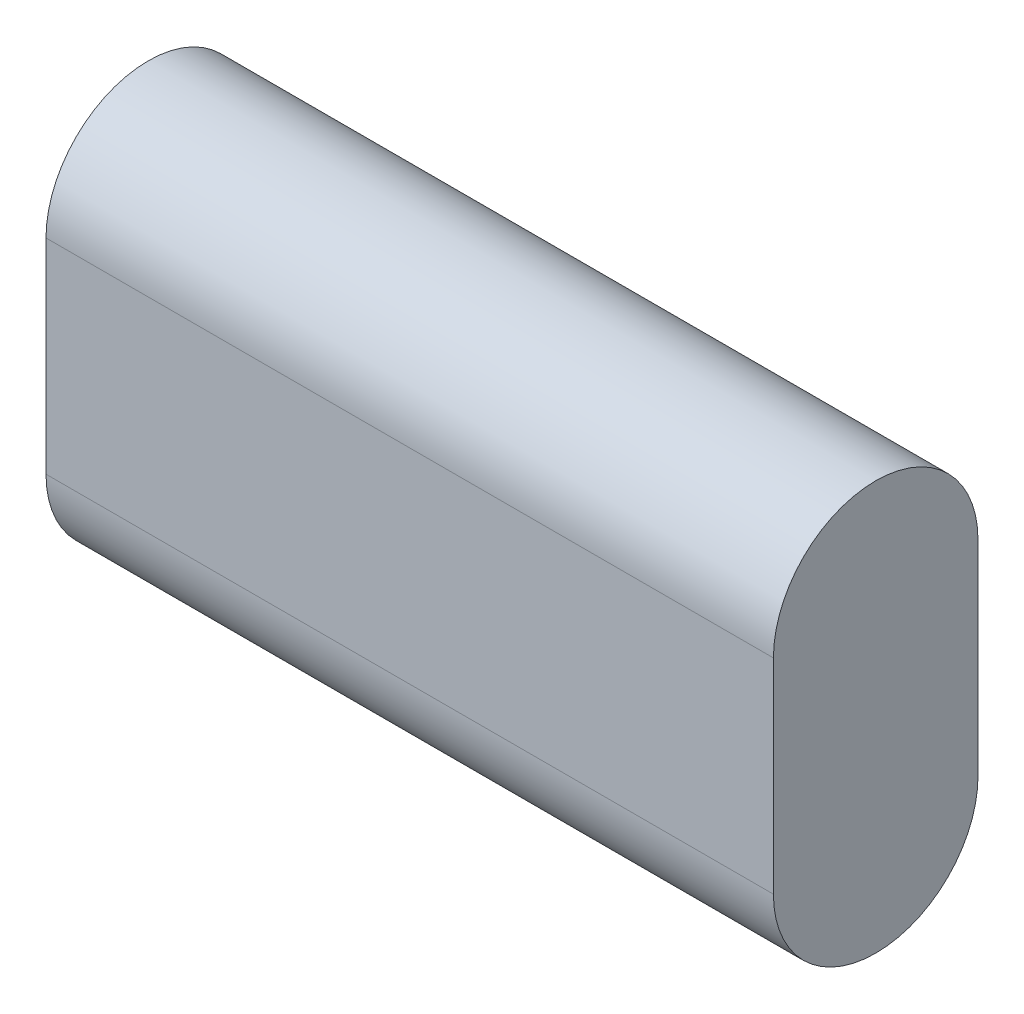
ISO-10303-21;
HEADER;
FILE_DESCRIPTION(('STEP AP214'),'2;1');
FILE_NAME('part.step','',(''),(''),'','','');
FILE_SCHEMA(('AUTOMOTIVE_DESIGN { 1 0 10303 214 1 1 1 1 }'));
ENDSEC;
DATA;
#1=APPLICATION_CONTEXT('core data for automotive mechanical design processes');
#2=APPLICATION_PROTOCOL_DEFINITION('international standard','automotive_design',2000,#1);
#3=PRODUCT_CONTEXT('',#1,'mechanical');
#4=PRODUCT('Part','Part','',(#3));
#5=PRODUCT_RELATED_PRODUCT_CATEGORY('part','',(#4));
#6=PRODUCT_DEFINITION_FORMATION('','',#4);
#7=PRODUCT_DEFINITION_CONTEXT('part definition',#1,'design');
#8=PRODUCT_DEFINITION('design','',#6,#7);
#9=PRODUCT_DEFINITION_SHAPE('','',#8);
#10=(LENGTH_UNIT() NAMED_UNIT(*) SI_UNIT(.MILLI.,.METRE.));
#11=(NAMED_UNIT(*) PLANE_ANGLE_UNIT() SI_UNIT($,.RADIAN.));
#12=(NAMED_UNIT(*) SI_UNIT($,.STERADIAN.) SOLID_ANGLE_UNIT());
#13=UNCERTAINTY_MEASURE_WITH_UNIT(LENGTH_MEASURE(1.E-05),#10,'distance_accuracy_value','');
#14=(GEOMETRIC_REPRESENTATION_CONTEXT(3) GLOBAL_UNCERTAINTY_ASSIGNED_CONTEXT((#13)) GLOBAL_UNIT_ASSIGNED_CONTEXT((#10,
#11,#12)) REPRESENTATION_CONTEXT('',''));
#15=CARTESIAN_POINT('',(0.,0.,0.));
#16=DIRECTION('',(0.,0.,1.));
#17=DIRECTION('',(1.,0.,0.));
#18=AXIS2_PLACEMENT_3D('',#15,#16,#17);
#19=CARTESIAN_POINT('',(64.,0.,0.));
#20=DIRECTION('',(-1.,0.,0.));
#21=DIRECTION('',(0.,0.,1.));
#22=AXIS2_PLACEMENT_3D('',#19,#20,#21);
#23=CYLINDRICAL_SURFACE('',#22,9.);
#24=CARTESIAN_POINT('',(0.,0.,0.));
#25=DIRECTION('',(1.,0.,0.));
#26=DIRECTION('',(0.,0.,-1.));
#27=AXIS2_PLACEMENT_3D('',#24,#25,#26);
#28=CIRCLE('',#27,9.);
#29=CARTESIAN_POINT('',(0.,0.,9.));
#30=VERTEX_POINT('',#29);
#31=CARTESIAN_POINT('',(0.,0.,-9.));
#32=VERTEX_POINT('',#31);
#33=EDGE_CURVE('E99',#30,#32,#28,.T.);
#34=ORIENTED_EDGE('',*,*,#33,.T.);
#35=DIRECTION('',(-1.,0.,0.));
#36=VECTOR('',#35,1.);
#37=CARTESIAN_POINT('',(64.,0.,-9.));
#38=LINE('',#37,#36);
#39=CARTESIAN_POINT('',(64.,0.,-9.));
#40=VERTEX_POINT('',#39);
#41=EDGE_CURVE('E11',#40,#32,#38,.T.);
#42=ORIENTED_EDGE('',*,*,#41,.F.);
#43=CARTESIAN_POINT('',(64.,0.,0.));
#44=DIRECTION('',(1.,0.,0.));
#45=DIRECTION('',(0.,0.,-1.));
#46=AXIS2_PLACEMENT_3D('',#43,#44,#45);
#47=CIRCLE('',#46,9.);
#48=CARTESIAN_POINT('',(64.,0.,9.));
#49=VERTEX_POINT('',#48);
#50=EDGE_CURVE('E87',#49,#40,#47,.T.);
#51=ORIENTED_EDGE('',*,*,#50,.F.);
#52=DIRECTION('',(-1.,0.,0.));
#53=VECTOR('',#52,1.);
#54=CARTESIAN_POINT('',(64.,0.,9.));
#55=LINE('',#54,#53);
#56=EDGE_CURVE('E95',#49,#30,#55,.T.);
#57=ORIENTED_EDGE('',*,*,#56,.T.);
#58=EDGE_LOOP('',(#34,#42,#51,#57));
#59=FACE_BOUND('',#58,.T.);
#60=ADVANCED_FACE('F36',(#59),#23,.T.);
#61=CARTESIAN_POINT('',(64.,0.,-9.));
#62=DIRECTION('',(0.,0.,1.));
#63=DIRECTION('',(1.,0.,0.));
#64=AXIS2_PLACEMENT_3D('',#61,#62,#63);
#65=PLANE('',#64);
#66=DIRECTION('',(0.,1.,0.));
#67=VECTOR('',#66,1.);
#68=CARTESIAN_POINT('',(0.,0.,-9.));
#69=LINE('',#68,#67);
#70=CARTESIAN_POINT('',(0.,18.,-9.));
#71=VERTEX_POINT('',#70);
#72=EDGE_CURVE('E91',#32,#71,#69,.T.);
#73=ORIENTED_EDGE('',*,*,#72,.T.);
#74=DIRECTION('',(-1.,0.,0.));
#75=VECTOR('',#74,1.);
#76=CARTESIAN_POINT('',(64.,18.,-9.));
#77=LINE('',#76,#75);
#78=CARTESIAN_POINT('',(64.,18.,-9.));
#79=VERTEX_POINT('',#78);
#80=EDGE_CURVE('E44',#79,#71,#77,.T.);
#81=ORIENTED_EDGE('',*,*,#80,.F.);
#82=DIRECTION('',(0.,1.,0.));
#83=VECTOR('',#82,1.);
#84=CARTESIAN_POINT('',(64.,0.,-9.));
#85=LINE('',#84,#83);
#86=EDGE_CURVE('E82',#40,#79,#85,.T.);
#87=ORIENTED_EDGE('',*,*,#86,.F.);
#88=ORIENTED_EDGE('',*,*,#41,.T.);
#89=EDGE_LOOP('',(#73,#81,#87,#88));
#90=FACE_BOUND('',#89,.T.);
#91=ADVANCED_FACE('F90',(#90),#65,.F.);
#92=CARTESIAN_POINT('',(64.,18.,0.));
#93=DIRECTION('',(-1.,0.,0.));
#94=DIRECTION('',(0.,0.,1.));
#95=AXIS2_PLACEMENT_3D('',#92,#93,#94);
#96=CYLINDRICAL_SURFACE('',#95,9.);
#97=CARTESIAN_POINT('',(0.,18.,0.));
#98=DIRECTION('',(1.,0.,0.));
#99=DIRECTION('',(0.,0.,-1.));
#100=AXIS2_PLACEMENT_3D('',#97,#98,#99);
#101=CIRCLE('',#100,9.);
#102=CARTESIAN_POINT('',(0.,18.,9.));
#103=VERTEX_POINT('',#102);
#104=EDGE_CURVE('E69',#71,#103,#101,.T.);
#105=ORIENTED_EDGE('',*,*,#104,.T.);
#106=DIRECTION('',(-1.,0.,0.));
#107=VECTOR('',#106,1.);
#108=CARTESIAN_POINT('',(64.,18.,9.));
#109=LINE('',#108,#107);
#110=CARTESIAN_POINT('',(64.,18.,9.));
#111=VERTEX_POINT('',#110);
#112=EDGE_CURVE('E92',#111,#103,#109,.T.);
#113=ORIENTED_EDGE('',*,*,#112,.F.);
#114=CARTESIAN_POINT('',(64.,18.,0.));
#115=DIRECTION('',(1.,0.,0.));
#116=DIRECTION('',(0.,0.,-1.));
#117=AXIS2_PLACEMENT_3D('',#114,#115,#116);
#118=CIRCLE('',#117,9.);
#119=EDGE_CURVE('E85',#79,#111,#118,.T.);
#120=ORIENTED_EDGE('',*,*,#119,.F.);
#121=ORIENTED_EDGE('',*,*,#80,.T.);
#122=EDGE_LOOP('',(#105,#113,#120,#121));
#123=FACE_BOUND('',#122,.T.);
#124=ADVANCED_FACE('F93',(#123),#96,.T.);
#125=CARTESIAN_POINT('',(64.,0.,9.));
#126=DIRECTION('',(0.,0.,-1.));
#127=DIRECTION('',(-1.,0.,0.));
#128=AXIS2_PLACEMENT_3D('',#125,#126,#127);
#129=PLANE('',#128);
#130=DIRECTION('',(0.,-1.,0.));
#131=VECTOR('',#130,1.);
#132=CARTESIAN_POINT('',(0.,0.,9.));
#133=LINE('',#132,#131);
#134=EDGE_CURVE('E75',#103,#30,#133,.T.);
#135=ORIENTED_EDGE('',*,*,#134,.T.);
#136=ORIENTED_EDGE('',*,*,#56,.F.);
#137=DIRECTION('',(0.,-1.,0.));
#138=VECTOR('',#137,1.);
#139=CARTESIAN_POINT('',(64.,0.,9.));
#140=LINE('',#139,#138);
#141=EDGE_CURVE('E52',#111,#49,#140,.T.);
#142=ORIENTED_EDGE('',*,*,#141,.F.);
#143=ORIENTED_EDGE('',*,*,#112,.T.);
#144=EDGE_LOOP('',(#135,#136,#142,#143));
#145=FACE_BOUND('',#144,.T.);
#146=ADVANCED_FACE('F106',(#145),#129,.F.);
#147=CARTESIAN_POINT('',(64.,0.,0.));
#148=DIRECTION('',(1.,0.,0.));
#149=DIRECTION('',(0.,0.,-1.));
#150=AXIS2_PLACEMENT_3D('',#147,#148,#149);
#151=PLANE('',#150);
#152=ORIENTED_EDGE('',*,*,#50,.T.);
#153=ORIENTED_EDGE('',*,*,#86,.T.);
#154=ORIENTED_EDGE('',*,*,#119,.T.);
#155=ORIENTED_EDGE('',*,*,#141,.T.);
#156=EDGE_LOOP('',(#152,#153,#154,#155));
#157=FACE_BOUND('',#156,.T.);
#158=ADVANCED_FACE('F83',(#157),#151,.T.);
#159=CARTESIAN_POINT('',(0.,0.,0.));
#160=DIRECTION('',(1.,0.,0.));
#161=DIRECTION('',(0.,0.,-1.));
#162=AXIS2_PLACEMENT_3D('',#159,#160,#161);
#163=PLANE('',#162);
#164=ORIENTED_EDGE('',*,*,#33,.F.);
#165=ORIENTED_EDGE('',*,*,#134,.F.);
#166=ORIENTED_EDGE('',*,*,#104,.F.);
#167=ORIENTED_EDGE('',*,*,#72,.F.);
#168=EDGE_LOOP('',(#164,#165,#166,#167));
#169=FACE_BOUND('',#168,.T.);
#170=ADVANCED_FACE('F109',(#169),#163,.F.);
#171=CLOSED_SHELL('',(#60,#91,#124,#146,#158,#170));
#172=MANIFOLD_SOLID_BREP('B2',#171);
#173=ADVANCED_BREP_SHAPE_REPRESENTATION('',(#18,#172),#14);
#174=SHAPE_DEFINITION_REPRESENTATION(#9,#173);
ENDSEC;
END-ISO-10303-21;
